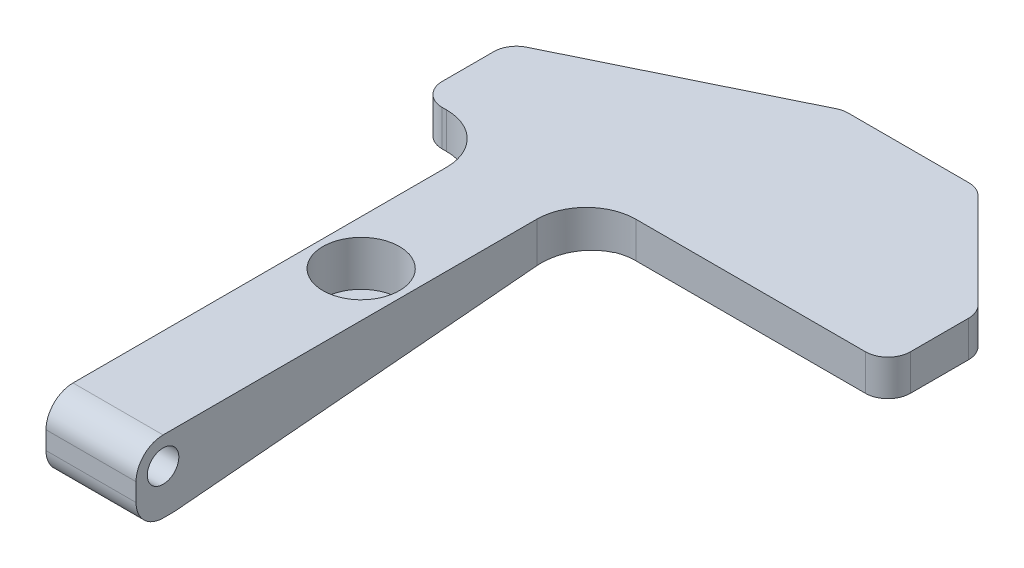
ISO-10303-21;
HEADER;
FILE_DESCRIPTION(('STEP AP214'),'2;1');
FILE_NAME('part.step','',(''),(''),'','','');
FILE_SCHEMA(('AUTOMOTIVE_DESIGN { 1 0 10303 214 1 1 1 1 }'));
ENDSEC;
DATA;
#1=APPLICATION_CONTEXT('core data for automotive mechanical design processes');
#2=APPLICATION_PROTOCOL_DEFINITION('international standard','automotive_design',2000,#1);
#3=PRODUCT_CONTEXT('',#1,'mechanical');
#4=PRODUCT('Part','Part','',(#3));
#5=PRODUCT_RELATED_PRODUCT_CATEGORY('part','',(#4));
#6=PRODUCT_DEFINITION_FORMATION('','',#4);
#7=PRODUCT_DEFINITION_CONTEXT('part definition',#1,'design');
#8=PRODUCT_DEFINITION('design','',#6,#7);
#9=PRODUCT_DEFINITION_SHAPE('','',#8);
#10=(LENGTH_UNIT() NAMED_UNIT(*) SI_UNIT(.MILLI.,.METRE.));
#11=(NAMED_UNIT(*) PLANE_ANGLE_UNIT() SI_UNIT($,.RADIAN.));
#12=(NAMED_UNIT(*) SI_UNIT($,.STERADIAN.) SOLID_ANGLE_UNIT());
#13=UNCERTAINTY_MEASURE_WITH_UNIT(LENGTH_MEASURE(1.E-05),#10,'distance_accuracy_value','');
#14=(GEOMETRIC_REPRESENTATION_CONTEXT(3) GLOBAL_UNCERTAINTY_ASSIGNED_CONTEXT((#13)) GLOBAL_UNIT_ASSIGNED_CONTEXT((#10,
#11,#12)) REPRESENTATION_CONTEXT('',''));
#15=CARTESIAN_POINT('',(0.,0.,0.));
#16=DIRECTION('',(0.,0.,1.));
#17=DIRECTION('',(1.,0.,0.));
#18=AXIS2_PLACEMENT_3D('',#15,#16,#17);
#19=CARTESIAN_POINT('',(8.5,0.,0.));
#20=DIRECTION('',(1.,0.,0.));
#21=DIRECTION('',(0.,0.,-1.));
#22=AXIS2_PLACEMENT_3D('',#19,#20,#21);
#23=PLANE('',#22);
#24=DIRECTION('',(0.,1.,0.));
#25=VECTOR('',#24,1.);
#26=CARTESIAN_POINT('',(8.5,-5.001,-46.6234753829799));
#27=LINE('',#26,#25);
#28=CARTESIAN_POINT('',(8.5,-1.,-46.6234753829799));
#29=VERTEX_POINT('',#28);
#30=CARTESIAN_POINT('',(8.5,-1.0329416355277,-46.6234753829799));
#31=VERTEX_POINT('',#30);
#32=EDGE_CURVE('E56',#29,#31,#27,.F.);
#33=ORIENTED_EDGE('',*,*,#32,.T.);
#34=DIRECTION('',(0.,0.0871557427476583,-0.996194698091746));
#35=VECTOR('',#34,1.);
#36=CARTESIAN_POINT('',(8.5,-5.07313605167897,-0.443841893046577));
#37=LINE('',#36,#35);
#38=CARTESIAN_POINT('',(8.5,-1.,-47.));
#39=VERTEX_POINT('',#38);
#40=EDGE_CURVE('E329',#31,#39,#37,.T.);
#41=ORIENTED_EDGE('',*,*,#40,.T.);
#42=DIRECTION('',(0.,0.,-1.));
#43=VECTOR('',#42,1.);
#44=CARTESIAN_POINT('',(8.5,-1.,0.));
#45=LINE('',#44,#43);
#46=EDGE_CURVE('E385',#29,#39,#45,.T.);
#47=ORIENTED_EDGE('',*,*,#46,.F.);
#48=EDGE_LOOP('',(#33,#41,#47));
#49=FACE_BOUND('',#48,.T.);
#50=ADVANCED_FACE('F41',(#49),#23,.T.);
#51=CARTESIAN_POINT('',(-8.5,0.,0.));
#52=DIRECTION('',(1.,0.,0.));
#53=DIRECTION('',(0.,0.,-1.));
#54=AXIS2_PLACEMENT_3D('',#51,#52,#53);
#55=PLANE('',#54);
#56=DIRECTION('',(0.,0.0871557427476583,-0.996194698091746));
#57=VECTOR('',#56,1.);
#58=CARTESIAN_POINT('',(-8.5,-5.07313605167897,-0.443841893046577));
#59=LINE('',#58,#57);
#60=CARTESIAN_POINT('',(-8.5,-1.03294163552769,-46.6234753829799));
#61=VERTEX_POINT('',#60);
#62=CARTESIAN_POINT('',(-8.5,-1.,-47.));
#63=VERTEX_POINT('',#62);
#64=EDGE_CURVE('E326',#61,#63,#59,.T.);
#65=ORIENTED_EDGE('',*,*,#64,.F.);
#66=DIRECTION('',(0.,1.,0.));
#67=VECTOR('',#66,1.);
#68=CARTESIAN_POINT('',(-8.5,-5.001,-46.6234753829799));
#69=LINE('',#68,#67);
#70=CARTESIAN_POINT('',(-8.5,-1.,-46.6234753829799));
#71=VERTEX_POINT('',#70);
#72=EDGE_CURVE('E369',#71,#61,#69,.F.);
#73=ORIENTED_EDGE('',*,*,#72,.F.);
#74=DIRECTION('',(0.,0.,1.));
#75=VECTOR('',#74,1.);
#76=CARTESIAN_POINT('',(-8.5,-1.,0.));
#77=LINE('',#76,#75);
#78=EDGE_CURVE('E381',#63,#71,#77,.T.);
#79=ORIENTED_EDGE('',*,*,#78,.F.);
#80=EDGE_LOOP('',(#65,#73,#79));
#81=FACE_BOUND('',#80,.T.);
#82=ADVANCED_FACE('F474',(#81),#55,.F.);
#83=CARTESIAN_POINT('',(8.5,3.,0.));
#84=DIRECTION('',(0.,1.,0.));
#85=DIRECTION('',(0.,0.,1.));
#86=AXIS2_PLACEMENT_3D('',#83,#84,#85);
#87=PLANE('',#86);
#88=DIRECTION('',(0.,0.,1.));
#89=VECTOR('',#88,1.);
#90=CARTESIAN_POINT('',(5.00000000000001,3.,3.));
#91=LINE('',#90,#89);
#92=CARTESIAN_POINT('',(4.99999999999999,3.,-41.5000000000004));
#93=VERTEX_POINT('',#92);
#94=CARTESIAN_POINT('',(5.,3.,0.));
#95=VERTEX_POINT('',#94);
#96=EDGE_CURVE('E221',#93,#95,#91,.T.);
#97=ORIENTED_EDGE('',*,*,#96,.F.);
#98=CARTESIAN_POINT('',(10.4999999999996,3.,-41.5000000000004));
#99=DIRECTION('',(0.,1.,0.));
#100=DIRECTION('',(0.,0.,1.));
#101=AXIS2_PLACEMENT_3D('',#98,#99,#100);
#102=CIRCLE('',#101,5.49999999999958);
#103=CARTESIAN_POINT('',(10.5,3.,-47.));
#104=VERTEX_POINT('',#103);
#105=EDGE_CURVE('E205',#104,#93,#102,.T.);
#106=ORIENTED_EDGE('',*,*,#105,.F.);
#107=DIRECTION('',(-1.,0.,0.));
#108=VECTOR('',#107,1.);
#109=CARTESIAN_POINT('',(0.,3.,-47.));
#110=LINE('',#109,#108);
#111=CARTESIAN_POINT('',(36.,3.,-47.));
#112=VERTEX_POINT('',#111);
#113=EDGE_CURVE('E219',#112,#104,#110,.T.);
#114=ORIENTED_EDGE('',*,*,#113,.F.);
#115=CARTESIAN_POINT('',(36.,3.,-49.5));
#116=DIRECTION('',(0.,1.,0.));
#117=DIRECTION('',(0.,0.,1.));
#118=AXIS2_PLACEMENT_3D('',#115,#116,#117);
#119=CIRCLE('',#118,2.5);
#120=CARTESIAN_POINT('',(38.5,3.,-49.5));
#121=VERTEX_POINT('',#120);
#122=EDGE_CURVE('E228',#121,#112,#119,.F.);
#123=ORIENTED_EDGE('',*,*,#122,.F.);
#124=DIRECTION('',(0.,0.,1.));
#125=VECTOR('',#124,1.);
#126=CARTESIAN_POINT('',(38.5000000000001,3.,0.));
#127=LINE('',#126,#125);
#128=CARTESIAN_POINT('',(38.5,3.,-55.9644660940673));
#129=VERTEX_POINT('',#128);
#130=EDGE_CURVE('E231',#129,#121,#127,.T.);
#131=ORIENTED_EDGE('',*,*,#130,.F.);
#132=CARTESIAN_POINT('',(36.,3.,-55.9644660940673));
#133=DIRECTION('',(0.,1.,0.));
#134=DIRECTION('',(0.,0.,1.));
#135=AXIS2_PLACEMENT_3D('',#132,#133,#134);
#136=CIRCLE('',#135,2.5);
#137=CARTESIAN_POINT('',(37.7677669529664,3.,-57.7322330470336));
#138=VERTEX_POINT('',#137);
#139=EDGE_CURVE('E238',#138,#129,#136,.F.);
#140=ORIENTED_EDGE('',*,*,#139,.F.);
#141=DIRECTION('',(0.707106781186549,0.,0.707106781186546));
#142=VECTOR('',#141,1.);
#143=CARTESIAN_POINT('',(47.7499999999999,3.,-47.7500000000001));
#144=LINE('',#143,#142);
#145=CARTESIAN_POINT('',(27.2322330470336,3.,-68.2677669529664));
#146=VERTEX_POINT('',#145);
#147=EDGE_CURVE('E240',#146,#138,#144,.T.);
#148=ORIENTED_EDGE('',*,*,#147,.F.);
#149=CARTESIAN_POINT('',(25.4644660940672,3.,-66.5));
#150=DIRECTION('',(0.,1.,0.));
#151=DIRECTION('',(0.,0.,1.));
#152=AXIS2_PLACEMENT_3D('',#149,#150,#151);
#153=CIRCLE('',#152,2.5);
#154=CARTESIAN_POINT('',(25.4644660940672,3.,-69.));
#155=VERTEX_POINT('',#154);
#156=EDGE_CURVE('E242',#155,#146,#153,.F.);
#157=ORIENTED_EDGE('',*,*,#156,.F.);
#158=DIRECTION('',(1.,0.,0.));
#159=VECTOR('',#158,1.);
#160=CARTESIAN_POINT('',(0.,3.,-69.));
#161=LINE('',#160,#159);
#162=CARTESIAN_POINT('',(12.0908773450815,3.,-69.));
#163=VERTEX_POINT('',#162);
#164=EDGE_CURVE('E244',#163,#155,#161,.T.);
#165=ORIENTED_EDGE('',*,*,#164,.F.);
#166=CARTESIAN_POINT('',(12.0908773450815,3.,-66.5));
#167=DIRECTION('',(0.,1.,0.));
#168=DIRECTION('',(0.,0.,1.));
#169=AXIS2_PLACEMENT_3D('',#166,#167,#168);
#170=CIRCLE('',#169,2.50000000000001);
#171=CARTESIAN_POINT('',(10.9949494781088,3.,-68.7469851157479));
#172=VERTEX_POINT('',#171);
#173=EDGE_CURVE('E246',#172,#163,#170,.F.);
#174=ORIENTED_EDGE('',*,*,#173,.F.);
#175=DIRECTION('',(0.898794046299168,0.,-0.438371146789076));
#176=VECTOR('',#175,1.);
#177=CARTESIAN_POINT('',(-24.9737904439826,3.,-51.2038584860941));
#178=LINE('',#177,#176);
#179=CARTESIAN_POINT('',(-12.0959278669727,3.,-57.4848117359746));
#180=VERTEX_POINT('',#179);
#181=EDGE_CURVE('E248',#180,#172,#178,.T.);
#182=ORIENTED_EDGE('',*,*,#181,.F.);
#183=CARTESIAN_POINT('',(-11.,3.,-55.2378266202267));
#184=DIRECTION('',(0.,1.,0.));
#185=DIRECTION('',(0.,0.,1.));
#186=AXIS2_PLACEMENT_3D('',#183,#184,#185);
#187=CIRCLE('',#186,2.5);
#188=CARTESIAN_POINT('',(-13.5,3.,-55.2378266202267));
#189=VERTEX_POINT('',#188);
#190=EDGE_CURVE('E250',#189,#180,#187,.F.);
#191=ORIENTED_EDGE('',*,*,#190,.F.);
#192=DIRECTION('',(0.,0.,-1.));
#193=VECTOR('',#192,1.);
#194=CARTESIAN_POINT('',(-13.5,3.,0.));
#195=LINE('',#194,#193);
#196=CARTESIAN_POINT('',(-13.5,3.,-49.5));
#197=VERTEX_POINT('',#196);
#198=EDGE_CURVE('E252',#197,#189,#195,.T.);
#199=ORIENTED_EDGE('',*,*,#198,.F.);
#200=CARTESIAN_POINT('',(-11.,3.,-49.5));
#201=DIRECTION('',(0.,1.,0.));
#202=DIRECTION('',(0.,0.,1.));
#203=AXIS2_PLACEMENT_3D('',#200,#201,#202);
#204=CIRCLE('',#203,2.5);
#205=CARTESIAN_POINT('',(-11.,3.,-47.));
#206=VERTEX_POINT('',#205);
#207=EDGE_CURVE('E233',#206,#197,#204,.F.);
#208=ORIENTED_EDGE('',*,*,#207,.F.);
#209=CARTESIAN_POINT('',(-10.5,3.,-47.));
#210=VERTEX_POINT('',#209);
#211=EDGE_CURVE('E229',#210,#206,#110,.T.);
#212=ORIENTED_EDGE('',*,*,#211,.F.);
#213=CARTESIAN_POINT('',(-10.4999999999996,3.,-41.5000000000004));
#214=DIRECTION('',(0.,1.,0.));
#215=DIRECTION('',(0.,0.,-1.));
#216=AXIS2_PLACEMENT_3D('',#213,#214,#215);
#217=CIRCLE('',#216,5.49999999999958);
#218=CARTESIAN_POINT('',(-5.,3.,-41.5000000000004));
#219=VERTEX_POINT('',#218);
#220=EDGE_CURVE('E366',#219,#210,#217,.T.);
#221=ORIENTED_EDGE('',*,*,#220,.F.);
#222=DIRECTION('',(0.,0.,-1.));
#223=VECTOR('',#222,1.);
#224=CARTESIAN_POINT('',(-5.,3.,3.));
#225=LINE('',#224,#223);
#226=CARTESIAN_POINT('',(-5.,3.,0.));
#227=VERTEX_POINT('',#226);
#228=EDGE_CURVE('E315',#227,#219,#225,.T.);
#229=ORIENTED_EDGE('',*,*,#228,.F.);
#230=DIRECTION('',(-1.,0.,0.));
#231=VECTOR('',#230,1.);
#232=CARTESIAN_POINT('',(8.5,3.,0.));
#233=LINE('',#232,#231);
#234=EDGE_CURVE('E341',#95,#227,#233,.T.);
#235=ORIENTED_EDGE('',*,*,#234,.F.);
#236=EDGE_LOOP('',(#97,#106,#114,#123,#131,#140,#148,#157,#165,#174,#182,#191,#199,#208,#212,
#221,#229,#235));
#237=FACE_BOUND('',#236,.T.);
#238=CARTESIAN_POINT('',(0.,3.,-27.));
#239=DIRECTION('',(0.,1.,0.));
#240=DIRECTION('',(0.,0.,1.));
#241=AXIS2_PLACEMENT_3D('',#238,#239,#240);
#242=CIRCLE('',#241,4.25);
#243=CARTESIAN_POINT('',(0.,3.,-22.75));
#244=VERTEX_POINT('',#243);
#245=EDGE_CURVE('E310',#244,#244,#242,.T.);
#246=ORIENTED_EDGE('',*,*,#245,.F.);
#247=EDGE_LOOP('',(#246));
#248=FACE_BOUND('',#247,.T.);
#249=ADVANCED_FACE('F216',(#237,#248),#87,.T.);
#250=CARTESIAN_POINT('',(8.5,0.,0.));
#251=DIRECTION('',(-1.,0.,0.));
#252=DIRECTION('',(0.,0.,1.));
#253=AXIS2_PLACEMENT_3D('',#250,#251,#252);
#254=CYLINDRICAL_SURFACE('',#253,3.);
#255=DIRECTION('',(-1.,0.,0.));
#256=VECTOR('',#255,1.);
#257=CARTESIAN_POINT('',(8.5,0.,3.));
#258=LINE('',#257,#256);
#259=CARTESIAN_POINT('',(5.00000000000001,0.,3.));
#260=VERTEX_POINT('',#259);
#261=CARTESIAN_POINT('',(-5.,0.,3.));
#262=VERTEX_POINT('',#261);
#263=EDGE_CURVE('E338',#260,#262,#258,.T.);
#264=ORIENTED_EDGE('',*,*,#263,.F.);
#265=CARTESIAN_POINT('',(5.00000000000001,0.,0.));
#266=DIRECTION('',(-1.,0.,0.));
#267=DIRECTION('',(0.,0.,1.));
#268=AXIS2_PLACEMENT_3D('',#265,#266,#267);
#269=CIRCLE('',#268,3.);
#270=EDGE_CURVE('E293',#95,#260,#269,.F.);
#271=ORIENTED_EDGE('',*,*,#270,.F.);
#272=ORIENTED_EDGE('',*,*,#234,.T.);
#273=CARTESIAN_POINT('',(-5.,0.,0.));
#274=DIRECTION('',(1.,0.,0.));
#275=DIRECTION('',(0.,0.,-1.));
#276=AXIS2_PLACEMENT_3D('',#273,#274,#275);
#277=CIRCLE('',#276,3.);
#278=EDGE_CURVE('E296',#262,#227,#277,.F.);
#279=ORIENTED_EDGE('',*,*,#278,.F.);
#280=EDGE_LOOP('',(#264,#271,#272,#279));
#281=FACE_BOUND('',#280,.T.);
#282=ADVANCED_FACE('F360',(#281),#254,.T.);
#283=CARTESIAN_POINT('',(8.5,0.,3.));
#284=DIRECTION('',(0.,0.,-1.));
#285=DIRECTION('',(0.,1.,0.));
#286=AXIS2_PLACEMENT_3D('',#283,#284,#285);
#287=PLANE('',#286);
#288=DIRECTION('',(-1.,0.,0.));
#289=VECTOR('',#288,1.);
#290=CARTESIAN_POINT('',(8.5,-2.,3.));
#291=LINE('',#290,#289);
#292=CARTESIAN_POINT('',(-5.,-2.,3.));
#293=VERTEX_POINT('',#292);
#294=CARTESIAN_POINT('',(5.00000000000001,-2.,3.));
#295=VERTEX_POINT('',#294);
#296=EDGE_CURVE('E11',#293,#295,#291,.F.);
#297=ORIENTED_EDGE('',*,*,#296,.T.);
#298=DIRECTION('',(0.,1.,0.));
#299=VECTOR('',#298,1.);
#300=CARTESIAN_POINT('',(5.00000000000001,-5.001,3.));
#301=LINE('',#300,#299);
#302=EDGE_CURVE('E307',#295,#260,#301,.T.);
#303=ORIENTED_EDGE('',*,*,#302,.T.);
#304=ORIENTED_EDGE('',*,*,#263,.T.);
#305=DIRECTION('',(0.,1.,0.));
#306=VECTOR('',#305,1.);
#307=CARTESIAN_POINT('',(-5.,-5.001,3.));
#308=LINE('',#307,#306);
#309=EDGE_CURVE('E318',#293,#262,#308,.T.);
#310=ORIENTED_EDGE('',*,*,#309,.F.);
#311=EDGE_LOOP('',(#297,#303,#304,#310));
#312=FACE_BOUND('',#311,.T.);
#313=ADVANCED_FACE('F356',(#312),#287,.F.);
#314=CARTESIAN_POINT('',(8.5,-5.,0.));
#315=DIRECTION('',(0.,1.,0.));
#316=DIRECTION('',(0.,0.,1.));
#317=AXIS2_PLACEMENT_3D('',#314,#315,#316);
#318=PLANE('',#317);
#319=DIRECTION('',(-1.,0.,0.));
#320=VECTOR('',#319,1.);
#321=CARTESIAN_POINT('',(8.5,-5.,-1.2797907889547));
#322=LINE('',#321,#320);
#323=CARTESIAN_POINT('',(5.,-5.,-1.2797907889547));
#324=VERTEX_POINT('',#323);
#325=CARTESIAN_POINT('',(-5.,-5.,-1.2797907889547));
#326=VERTEX_POINT('',#325);
#327=EDGE_CURVE('E335',#324,#326,#322,.T.);
#328=ORIENTED_EDGE('',*,*,#327,.F.);
#329=DIRECTION('',(0.,0.,-1.));
#330=VECTOR('',#329,1.);
#331=CARTESIAN_POINT('',(5.00000000000001,-5.,3.));
#332=LINE('',#331,#330);
#333=CARTESIAN_POINT('',(5.00000000000001,-5.,0.));
#334=VERTEX_POINT('',#333);
#335=EDGE_CURVE('E304',#334,#324,#332,.T.);
#336=ORIENTED_EDGE('',*,*,#335,.F.);
#337=DIRECTION('',(-1.,0.,0.));
#338=VECTOR('',#337,1.);
#339=CARTESIAN_POINT('',(8.5,-5.,0.));
#340=LINE('',#339,#338);
#341=CARTESIAN_POINT('',(-5.,-5.,0.));
#342=VERTEX_POINT('',#341);
#343=EDGE_CURVE('E49',#334,#342,#340,.T.);
#344=ORIENTED_EDGE('',*,*,#343,.T.);
#345=DIRECTION('',(0.,0.,1.));
#346=VECTOR('',#345,1.);
#347=CARTESIAN_POINT('',(-5.,-5.,3.));
#348=LINE('',#347,#346);
#349=EDGE_CURVE('E64',#326,#342,#348,.T.);
#350=ORIENTED_EDGE('',*,*,#349,.F.);
#351=EDGE_LOOP('',(#328,#336,#344,#350));
#352=FACE_BOUND('',#351,.T.);
#353=ADVANCED_FACE('F348',(#352),#318,.F.);
#354=CARTESIAN_POINT('',(8.5,-5.07313605167897,-0.443841893046577));
#355=DIRECTION('',(0.,0.996194698091746,0.0871557427476583));
#356=DIRECTION('',(0.,-0.0871557427476583,0.996194698091746));
#357=AXIS2_PLACEMENT_3D('',#354,#355,#356);
#358=PLANE('',#357);
#359=CARTESIAN_POINT('',(10.4999999999996,-1.48118764939255,-41.5000000000004));
#360=DIRECTION('',(0.,0.996194698091746,0.0871557427476583));
#361=DIRECTION('',(0.,0.0871557427476583,-0.996194698091746));
#362=AXIS2_PLACEMENT_3D('',#359,#360,#361);
#363=ELLIPSE('',#362,5.52100910648799,5.49999999999958);
#364=CARTESIAN_POINT('',(4.99999999999999,-1.48118764939255,-41.5000000000004));
#365=VERTEX_POINT('',#364);
#366=EDGE_CURVE('E459',#365,#31,#363,.F.);
#367=ORIENTED_EDGE('',*,*,#366,.F.);
#368=DIRECTION('',(0.,0.0871557427476583,-0.996194698091746));
#369=VECTOR('',#368,1.);
#370=CARTESIAN_POINT('',(5.00000000000001,-5.37159653177234,2.96757700472789));
#371=LINE('',#370,#369);
#372=EDGE_CURVE('E302',#324,#365,#371,.T.);
#373=ORIENTED_EDGE('',*,*,#372,.F.);
#374=ORIENTED_EDGE('',*,*,#327,.T.);
#375=DIRECTION('',(0.,-0.0871557427476583,0.996194698091746));
#376=VECTOR('',#375,1.);
#377=CARTESIAN_POINT('',(-5.,-5.37159653177234,2.96757700472789));
#378=LINE('',#377,#376);
#379=CARTESIAN_POINT('',(-5.,-1.48118764939255,-41.5000000000004));
#380=VERTEX_POINT('',#379);
#381=EDGE_CURVE('E258',#380,#326,#378,.T.);
#382=ORIENTED_EDGE('',*,*,#381,.F.);
#383=CARTESIAN_POINT('',(-10.4999999999996,-1.48118764939255,-41.5000000000004));
#384=DIRECTION('',(0.,0.996194698091746,0.0871557427476583));
#385=DIRECTION('',(0.,0.0871557427476583,-0.996194698091746));
#386=AXIS2_PLACEMENT_3D('',#383,#384,#385);
#387=ELLIPSE('',#386,5.52100910648799,5.49999999999958);
#388=EDGE_CURVE('E464',#61,#380,#387,.F.);
#389=ORIENTED_EDGE('',*,*,#388,.F.);
#390=ORIENTED_EDGE('',*,*,#64,.T.);
#391=DIRECTION('',(-1.,0.,0.));
#392=VECTOR('',#391,1.);
#393=CARTESIAN_POINT('',(8.5,-1.,-47.));
#394=LINE('',#393,#392);
#395=EDGE_CURVE('E331',#39,#63,#394,.T.);
#396=ORIENTED_EDGE('',*,*,#395,.F.);
#397=ORIENTED_EDGE('',*,*,#40,.F.);
#398=EDGE_LOOP('',(#367,#373,#374,#382,#389,#390,#396,#397));
#399=FACE_BOUND('',#398,.T.);
#400=ADVANCED_FACE('F479',(#399),#358,.F.);
#401=CARTESIAN_POINT('',(8.5,-2.,0.));
#402=DIRECTION('',(-1.,0.,0.));
#403=DIRECTION('',(0.,0.,1.));
#404=AXIS2_PLACEMENT_3D('',#401,#402,#403);
#405=CYLINDRICAL_SURFACE('',#404,3.);
#406=CARTESIAN_POINT('',(5.00000000000001,-2.,0.));
#407=DIRECTION('',(-1.,0.,0.));
#408=DIRECTION('',(0.,0.,1.));
#409=AXIS2_PLACEMENT_3D('',#406,#407,#408);
#410=CIRCLE('',#409,3.);
#411=EDGE_CURVE('E295',#334,#295,#410,.T.);
#412=ORIENTED_EDGE('',*,*,#411,.T.);
#413=ORIENTED_EDGE('',*,*,#296,.F.);
#414=CARTESIAN_POINT('',(-5.,-2.,0.));
#415=DIRECTION('',(1.,0.,0.));
#416=DIRECTION('',(0.,0.,-1.));
#417=AXIS2_PLACEMENT_3D('',#414,#415,#416);
#418=CIRCLE('',#417,3.);
#419=EDGE_CURVE('E314',#293,#342,#418,.T.);
#420=ORIENTED_EDGE('',*,*,#419,.T.);
#421=ORIENTED_EDGE('',*,*,#343,.F.);
#422=EDGE_LOOP('',(#412,#413,#420,#421));
#423=FACE_BOUND('',#422,.T.);
#424=ADVANCED_FACE('F43',(#423),#405,.T.);
#425=CARTESIAN_POINT('',(0.,-2.,-27.));
#426=DIRECTION('',(0.,1.,0.));
#427=DIRECTION('',(0.,0.,1.));
#428=AXIS2_PLACEMENT_3D('',#425,#426,#427);
#429=CYLINDRICAL_SURFACE('',#428,4.25);
#430=CARTESIAN_POINT('',(0.,-2.,-27.));
#431=DIRECTION('',(0.,1.,0.));
#432=DIRECTION('',(0.,0.,1.));
#433=AXIS2_PLACEMENT_3D('',#430,#431,#432);
#434=CIRCLE('',#433,4.25);
#435=CARTESIAN_POINT('',(0.,-2.,-22.75));
#436=VERTEX_POINT('',#435);
#437=EDGE_CURVE('E323',#436,#436,#434,.T.);
#438=ORIENTED_EDGE('',*,*,#437,.F.);
#439=EDGE_LOOP('',(#438));
#440=FACE_BOUND('',#439,.T.);
#441=ORIENTED_EDGE('',*,*,#245,.T.);
#442=EDGE_LOOP('',(#441));
#443=FACE_BOUND('',#442,.T.);
#444=ADVANCED_FACE('F499',(#440,#443),#429,.F.);
#445=CARTESIAN_POINT('',(0.,-2.,-27.));
#446=DIRECTION('',(0.,1.,0.));
#447=DIRECTION('',(0.,0.,1.));
#448=AXIS2_PLACEMENT_3D('',#445,#446,#447);
#449=PLANE('',#448);
#450=ORIENTED_EDGE('',*,*,#437,.T.);
#451=EDGE_LOOP('',(#450));
#452=FACE_BOUND('',#451,.T.);
#453=ADVANCED_FACE('F493',(#452),#449,.T.);
#454=CARTESIAN_POINT('',(-5.,-5.001,3.));
#455=DIRECTION('',(1.,0.,0.));
#456=DIRECTION('',(0.,0.,-1.));
#457=AXIS2_PLACEMENT_3D('',#454,#455,#456);
#458=PLANE('',#457);
#459=ORIENTED_EDGE('',*,*,#278,.T.);
#460=ORIENTED_EDGE('',*,*,#228,.T.);
#461=DIRECTION('',(0.,1.,0.));
#462=VECTOR('',#461,1.);
#463=CARTESIAN_POINT('',(-5.,-5.001,-41.5000000000004));
#464=LINE('',#463,#462);
#465=EDGE_CURVE('E370',#380,#219,#464,.T.);
#466=ORIENTED_EDGE('',*,*,#465,.F.);
#467=ORIENTED_EDGE('',*,*,#381,.T.);
#468=ORIENTED_EDGE('',*,*,#349,.T.);
#469=ORIENTED_EDGE('',*,*,#419,.F.);
#470=ORIENTED_EDGE('',*,*,#309,.T.);
#471=EDGE_LOOP('',(#459,#460,#466,#467,#468,#469,#470));
#472=FACE_BOUND('',#471,.T.);
#473=CARTESIAN_POINT('',(-5.,0.,0.));
#474=DIRECTION('',(1.,0.,0.));
#475=DIRECTION('',(0.,0.,-1.));
#476=AXIS2_PLACEMENT_3D('',#473,#474,#475);
#477=CIRCLE('',#476,1.75);
#478=CARTESIAN_POINT('',(-5.,0.,-1.75));
#479=VERTEX_POINT('',#478);
#480=EDGE_CURVE('E311',#479,#479,#477,.F.);
#481=ORIENTED_EDGE('',*,*,#480,.F.);
#482=EDGE_LOOP('',(#481));
#483=FACE_BOUND('',#482,.T.);
#484=ADVANCED_FACE('F352',(#472,#483),#458,.F.);
#485=CARTESIAN_POINT('',(5.00000000000001,-5.001,3.));
#486=DIRECTION('',(-1.,0.,0.));
#487=DIRECTION('',(0.,0.,1.));
#488=AXIS2_PLACEMENT_3D('',#485,#486,#487);
#489=PLANE('',#488);
#490=ORIENTED_EDGE('',*,*,#270,.T.);
#491=ORIENTED_EDGE('',*,*,#302,.F.);
#492=ORIENTED_EDGE('',*,*,#411,.F.);
#493=ORIENTED_EDGE('',*,*,#335,.T.);
#494=ORIENTED_EDGE('',*,*,#372,.T.);
#495=DIRECTION('',(0.,1.,0.));
#496=VECTOR('',#495,1.);
#497=CARTESIAN_POINT('',(4.99999999999999,-5.001,-41.5000000000004));
#498=LINE('',#497,#496);
#499=EDGE_CURVE('E223',#365,#93,#498,.T.);
#500=ORIENTED_EDGE('',*,*,#499,.T.);
#501=ORIENTED_EDGE('',*,*,#96,.T.);
#502=EDGE_LOOP('',(#490,#491,#492,#493,#494,#500,#501));
#503=FACE_BOUND('',#502,.T.);
#504=CARTESIAN_POINT('',(5.00000000000001,0.,0.));
#505=DIRECTION('',(-1.,0.,0.));
#506=DIRECTION('',(0.,0.,1.));
#507=AXIS2_PLACEMENT_3D('',#504,#505,#506);
#508=CIRCLE('',#507,1.75);
#509=CARTESIAN_POINT('',(5.00000000000001,0.,1.75));
#510=VERTEX_POINT('',#509);
#511=EDGE_CURVE('E299',#510,#510,#508,.F.);
#512=ORIENTED_EDGE('',*,*,#511,.F.);
#513=EDGE_LOOP('',(#512));
#514=FACE_BOUND('',#513,.T.);
#515=ADVANCED_FACE('F482',(#503,#514),#489,.F.);
#516=CARTESIAN_POINT('',(8.5,0.,0.));
#517=DIRECTION('',(-1.,0.,0.));
#518=DIRECTION('',(0.,0.,1.));
#519=AXIS2_PLACEMENT_3D('',#516,#517,#518);
#520=CYLINDRICAL_SURFACE('',#519,1.75);
#521=ORIENTED_EDGE('',*,*,#511,.T.);
#522=EDGE_LOOP('',(#521));
#523=FACE_BOUND('',#522,.T.);
#524=ORIENTED_EDGE('',*,*,#480,.T.);
#525=EDGE_LOOP('',(#524));
#526=FACE_BOUND('',#525,.T.);
#527=ADVANCED_FACE('F485',(#523,#526),#520,.F.);
#528=CARTESIAN_POINT('',(-11.,-1.,-49.5));
#529=DIRECTION('',(0.,1.,0.));
#530=DIRECTION('',(0.,0.,1.));
#531=AXIS2_PLACEMENT_3D('',#528,#529,#530);
#532=CYLINDRICAL_SURFACE('',#531,2.5);
#533=ORIENTED_EDGE('',*,*,#207,.T.);
#534=DIRECTION('',(0.,1.,0.));
#535=VECTOR('',#534,1.);
#536=CARTESIAN_POINT('',(-13.5,-1.,-49.5));
#537=LINE('',#536,#535);
#538=CARTESIAN_POINT('',(-13.5,-1.,-49.5));
#539=VERTEX_POINT('',#538);
#540=EDGE_CURVE('E255',#539,#197,#537,.T.);
#541=ORIENTED_EDGE('',*,*,#540,.F.);
#542=CARTESIAN_POINT('',(-11.,-1.,-49.5));
#543=DIRECTION('',(0.,1.,0.));
#544=DIRECTION('',(0.,0.,1.));
#545=AXIS2_PLACEMENT_3D('',#542,#543,#544);
#546=CIRCLE('',#545,2.5);
#547=CARTESIAN_POINT('',(-11.,-1.,-47.));
#548=VERTEX_POINT('',#547);
#549=EDGE_CURVE('E254',#548,#539,#546,.F.);
#550=ORIENTED_EDGE('',*,*,#549,.F.);
#551=DIRECTION('',(0.,1.,0.));
#552=VECTOR('',#551,1.);
#553=CARTESIAN_POINT('',(-11.,-1.,-47.));
#554=LINE('',#553,#552);
#555=EDGE_CURVE('E289',#548,#206,#554,.T.);
#556=ORIENTED_EDGE('',*,*,#555,.T.);
#557=EDGE_LOOP('',(#533,#541,#550,#556));
#558=FACE_BOUND('',#557,.T.);
#559=ADVANCED_FACE('F457',(#558),#532,.T.);
#560=CARTESIAN_POINT('',(-13.5,-1.,0.));
#561=DIRECTION('',(1.,0.,0.));
#562=DIRECTION('',(0.,0.,-1.));
#563=AXIS2_PLACEMENT_3D('',#560,#561,#562);
#564=PLANE('',#563);
#565=ORIENTED_EDGE('',*,*,#198,.T.);
#566=DIRECTION('',(0.,1.,0.));
#567=VECTOR('',#566,1.);
#568=CARTESIAN_POINT('',(-13.5,-1.,-55.2378266202267));
#569=LINE('',#568,#567);
#570=CARTESIAN_POINT('',(-13.5,-1.,-55.2378266202267));
#571=VERTEX_POINT('',#570);
#572=EDGE_CURVE('E259',#571,#189,#569,.T.);
#573=ORIENTED_EDGE('',*,*,#572,.F.);
#574=DIRECTION('',(0.,0.,-1.));
#575=VECTOR('',#574,1.);
#576=CARTESIAN_POINT('',(-13.5,-1.,0.));
#577=LINE('',#576,#575);
#578=EDGE_CURVE('E292',#539,#571,#577,.T.);
#579=ORIENTED_EDGE('',*,*,#578,.F.);
#580=ORIENTED_EDGE('',*,*,#540,.T.);
#581=EDGE_LOOP('',(#565,#573,#579,#580));
#582=FACE_BOUND('',#581,.T.);
#583=ADVANCED_FACE('F413',(#582),#564,.F.);
#584=CARTESIAN_POINT('',(-11.,-1.,-55.2378266202267));
#585=DIRECTION('',(0.,1.,0.));
#586=DIRECTION('',(0.,0.,1.));
#587=AXIS2_PLACEMENT_3D('',#584,#585,#586);
#588=CYLINDRICAL_SURFACE('',#587,2.5);
#589=ORIENTED_EDGE('',*,*,#190,.T.);
#590=DIRECTION('',(0.,1.,0.));
#591=VECTOR('',#590,1.);
#592=CARTESIAN_POINT('',(-12.0959278669727,-1.,-57.4848117359746));
#593=LINE('',#592,#591);
#594=CARTESIAN_POINT('',(-12.0959278669727,-1.,-57.4848117359746));
#595=VERTEX_POINT('',#594);
#596=EDGE_CURVE('E262',#595,#180,#593,.T.);
#597=ORIENTED_EDGE('',*,*,#596,.F.);
#598=CARTESIAN_POINT('',(-11.,-1.,-55.2378266202267));
#599=DIRECTION('',(0.,1.,0.));
#600=DIRECTION('',(0.,0.,1.));
#601=AXIS2_PLACEMENT_3D('',#598,#599,#600);
#602=CIRCLE('',#601,2.5);
#603=EDGE_CURVE('E404',#571,#595,#602,.F.);
#604=ORIENTED_EDGE('',*,*,#603,.F.);
#605=ORIENTED_EDGE('',*,*,#572,.T.);
#606=EDGE_LOOP('',(#589,#597,#604,#605));
#607=FACE_BOUND('',#606,.T.);
#608=ADVANCED_FACE('F416',(#607),#588,.T.);
#609=CARTESIAN_POINT('',(-24.9737904439826,-1.,-51.2038584860941));
#610=DIRECTION('',(0.438371146789076,0.,0.898794046299168));
#611=DIRECTION('',(0.898794046299168,0.,-0.438371146789076));
#612=AXIS2_PLACEMENT_3D('',#609,#610,#611);
#613=PLANE('',#612);
#614=ORIENTED_EDGE('',*,*,#181,.T.);
#615=DIRECTION('',(0.,1.,0.));
#616=VECTOR('',#615,1.);
#617=CARTESIAN_POINT('',(10.9949494781088,-1.,-68.7469851157479));
#618=LINE('',#617,#616);
#619=CARTESIAN_POINT('',(10.9949494781088,-1.,-68.7469851157479));
#620=VERTEX_POINT('',#619);
#621=EDGE_CURVE('E265',#620,#172,#618,.T.);
#622=ORIENTED_EDGE('',*,*,#621,.F.);
#623=DIRECTION('',(0.898794046299168,0.,-0.438371146789076));
#624=VECTOR('',#623,1.);
#625=CARTESIAN_POINT('',(-24.9737904439826,-1.,-51.2038584860941));
#626=LINE('',#625,#624);
#627=EDGE_CURVE('E402',#595,#620,#626,.T.);
#628=ORIENTED_EDGE('',*,*,#627,.F.);
#629=ORIENTED_EDGE('',*,*,#596,.T.);
#630=EDGE_LOOP('',(#614,#622,#628,#629));
#631=FACE_BOUND('',#630,.T.);
#632=ADVANCED_FACE('F421',(#631),#613,.F.);
#633=CARTESIAN_POINT('',(12.0908773450815,-1.,-66.5));
#634=DIRECTION('',(0.,1.,0.));
#635=DIRECTION('',(0.,0.,1.));
#636=AXIS2_PLACEMENT_3D('',#633,#634,#635);
#637=CYLINDRICAL_SURFACE('',#636,2.50000000000001);
#638=ORIENTED_EDGE('',*,*,#173,.T.);
#639=DIRECTION('',(0.,1.,0.));
#640=VECTOR('',#639,1.);
#641=CARTESIAN_POINT('',(12.0908773450815,-1.,-69.));
#642=LINE('',#641,#640);
#643=CARTESIAN_POINT('',(12.0908773450815,-1.,-69.));
#644=VERTEX_POINT('',#643);
#645=EDGE_CURVE('E268',#644,#163,#642,.T.);
#646=ORIENTED_EDGE('',*,*,#645,.F.);
#647=CARTESIAN_POINT('',(12.0908773450815,-1.,-66.5));
#648=DIRECTION('',(0.,1.,0.));
#649=DIRECTION('',(0.,0.,1.));
#650=AXIS2_PLACEMENT_3D('',#647,#648,#649);
#651=CIRCLE('',#650,2.50000000000001);
#652=EDGE_CURVE('E400',#620,#644,#651,.F.);
#653=ORIENTED_EDGE('',*,*,#652,.F.);
#654=ORIENTED_EDGE('',*,*,#621,.T.);
#655=EDGE_LOOP('',(#638,#646,#653,#654));
#656=FACE_BOUND('',#655,.T.);
#657=ADVANCED_FACE('F427',(#656),#637,.T.);
#658=CARTESIAN_POINT('',(0.,-1.,-69.));
#659=DIRECTION('',(0.,0.,1.));
#660=DIRECTION('',(1.,0.,0.));
#661=AXIS2_PLACEMENT_3D('',#658,#659,#660);
#662=PLANE('',#661);
#663=ORIENTED_EDGE('',*,*,#164,.T.);
#664=DIRECTION('',(0.,1.,0.));
#665=VECTOR('',#664,1.);
#666=CARTESIAN_POINT('',(25.4644660940672,-1.,-69.));
#667=LINE('',#666,#665);
#668=CARTESIAN_POINT('',(25.4644660940672,-1.,-69.));
#669=VERTEX_POINT('',#668);
#670=EDGE_CURVE('E271',#669,#155,#667,.T.);
#671=ORIENTED_EDGE('',*,*,#670,.F.);
#672=DIRECTION('',(1.,0.,0.));
#673=VECTOR('',#672,1.);
#674=CARTESIAN_POINT('',(0.,-1.,-69.));
#675=LINE('',#674,#673);
#676=EDGE_CURVE('E398',#644,#669,#675,.T.);
#677=ORIENTED_EDGE('',*,*,#676,.F.);
#678=ORIENTED_EDGE('',*,*,#645,.T.);
#679=EDGE_LOOP('',(#663,#671,#677,#678));
#680=FACE_BOUND('',#679,.T.);
#681=ADVANCED_FACE('F431',(#680),#662,.F.);
#682=CARTESIAN_POINT('',(25.4644660940672,-1.,-66.5));
#683=DIRECTION('',(0.,1.,0.));
#684=DIRECTION('',(0.,0.,1.));
#685=AXIS2_PLACEMENT_3D('',#682,#683,#684);
#686=CYLINDRICAL_SURFACE('',#685,2.5);
#687=ORIENTED_EDGE('',*,*,#156,.T.);
#688=DIRECTION('',(0.,1.,0.));
#689=VECTOR('',#688,1.);
#690=CARTESIAN_POINT('',(27.2322330470336,-1.,-68.2677669529664));
#691=LINE('',#690,#689);
#692=CARTESIAN_POINT('',(27.2322330470336,-1.,-68.2677669529664));
#693=VERTEX_POINT('',#692);
#694=EDGE_CURVE('E274',#693,#146,#691,.T.);
#695=ORIENTED_EDGE('',*,*,#694,.F.);
#696=CARTESIAN_POINT('',(25.4644660940672,-1.,-66.5));
#697=DIRECTION('',(0.,1.,0.));
#698=DIRECTION('',(0.,0.,1.));
#699=AXIS2_PLACEMENT_3D('',#696,#697,#698);
#700=CIRCLE('',#699,2.5);
#701=EDGE_CURVE('E396',#669,#693,#700,.F.);
#702=ORIENTED_EDGE('',*,*,#701,.F.);
#703=ORIENTED_EDGE('',*,*,#670,.T.);
#704=EDGE_LOOP('',(#687,#695,#702,#703));
#705=FACE_BOUND('',#704,.T.);
#706=ADVANCED_FACE('F436',(#705),#686,.T.);
#707=CARTESIAN_POINT('',(47.7499999999999,-1.,-47.7500000000001));
#708=DIRECTION('',(-0.707106781186546,0.,0.707106781186549));
#709=DIRECTION('',(0.707106781186549,0.,0.707106781186546));
#710=AXIS2_PLACEMENT_3D('',#707,#708,#709);
#711=PLANE('',#710);
#712=ORIENTED_EDGE('',*,*,#147,.T.);
#713=DIRECTION('',(0.,1.,0.));
#714=VECTOR('',#713,1.);
#715=CARTESIAN_POINT('',(37.7677669529664,-1.,-57.7322330470336));
#716=LINE('',#715,#714);
#717=CARTESIAN_POINT('',(37.7677669529664,-1.,-57.7322330470336));
#718=VERTEX_POINT('',#717);
#719=EDGE_CURVE('E277',#718,#138,#716,.T.);
#720=ORIENTED_EDGE('',*,*,#719,.F.);
#721=DIRECTION('',(0.707106781186549,0.,0.707106781186546));
#722=VECTOR('',#721,1.);
#723=CARTESIAN_POINT('',(47.7499999999999,-1.,-47.7500000000001));
#724=LINE('',#723,#722);
#725=EDGE_CURVE('E394',#693,#718,#724,.T.);
#726=ORIENTED_EDGE('',*,*,#725,.F.);
#727=ORIENTED_EDGE('',*,*,#694,.T.);
#728=EDGE_LOOP('',(#712,#720,#726,#727));
#729=FACE_BOUND('',#728,.T.);
#730=ADVANCED_FACE('F442',(#729),#711,.F.);
#731=CARTESIAN_POINT('',(36.,-1.,-55.9644660940673));
#732=DIRECTION('',(0.,1.,0.));
#733=DIRECTION('',(0.,0.,1.));
#734=AXIS2_PLACEMENT_3D('',#731,#732,#733);
#735=CYLINDRICAL_SURFACE('',#734,2.5);
#736=ORIENTED_EDGE('',*,*,#139,.T.);
#737=DIRECTION('',(0.,1.,0.));
#738=VECTOR('',#737,1.);
#739=CARTESIAN_POINT('',(38.5,-1.,-55.9644660940673));
#740=LINE('',#739,#738);
#741=CARTESIAN_POINT('',(38.5,-1.,-55.9644660940673));
#742=VERTEX_POINT('',#741);
#743=EDGE_CURVE('E280',#742,#129,#740,.T.);
#744=ORIENTED_EDGE('',*,*,#743,.F.);
#745=CARTESIAN_POINT('',(36.,-1.,-55.9644660940673));
#746=DIRECTION('',(0.,1.,0.));
#747=DIRECTION('',(0.,0.,1.));
#748=AXIS2_PLACEMENT_3D('',#745,#746,#747);
#749=CIRCLE('',#748,2.5);
#750=EDGE_CURVE('E392',#718,#742,#749,.F.);
#751=ORIENTED_EDGE('',*,*,#750,.F.);
#752=ORIENTED_EDGE('',*,*,#719,.T.);
#753=EDGE_LOOP('',(#736,#744,#751,#752));
#754=FACE_BOUND('',#753,.T.);
#755=ADVANCED_FACE('F446',(#754),#735,.T.);
#756=CARTESIAN_POINT('',(38.5000000000001,-1.,0.));
#757=DIRECTION('',(-1.,0.,0.));
#758=DIRECTION('',(0.,0.,1.));
#759=AXIS2_PLACEMENT_3D('',#756,#757,#758);
#760=PLANE('',#759);
#761=ORIENTED_EDGE('',*,*,#130,.T.);
#762=DIRECTION('',(0.,1.,0.));
#763=VECTOR('',#762,1.);
#764=CARTESIAN_POINT('',(38.5,-1.,-49.5));
#765=LINE('',#764,#763);
#766=CARTESIAN_POINT('',(38.5,-1.,-49.5));
#767=VERTEX_POINT('',#766);
#768=EDGE_CURVE('E283',#767,#121,#765,.T.);
#769=ORIENTED_EDGE('',*,*,#768,.F.);
#770=DIRECTION('',(0.,0.,1.));
#771=VECTOR('',#770,1.);
#772=CARTESIAN_POINT('',(38.5000000000001,-1.,0.));
#773=LINE('',#772,#771);
#774=EDGE_CURVE('E390',#742,#767,#773,.T.);
#775=ORIENTED_EDGE('',*,*,#774,.F.);
#776=ORIENTED_EDGE('',*,*,#743,.T.);
#777=EDGE_LOOP('',(#761,#769,#775,#776));
#778=FACE_BOUND('',#777,.T.);
#779=ADVANCED_FACE('F451',(#778),#760,.F.);
#780=CARTESIAN_POINT('',(36.,-1.,-49.5));
#781=DIRECTION('',(0.,1.,0.));
#782=DIRECTION('',(0.,0.,1.));
#783=AXIS2_PLACEMENT_3D('',#780,#781,#782);
#784=CYLINDRICAL_SURFACE('',#783,2.5);
#785=ORIENTED_EDGE('',*,*,#122,.T.);
#786=DIRECTION('',(0.,1.,0.));
#787=VECTOR('',#786,1.);
#788=CARTESIAN_POINT('',(36.,-1.,-47.));
#789=LINE('',#788,#787);
#790=CARTESIAN_POINT('',(36.,-1.,-47.));
#791=VERTEX_POINT('',#790);
#792=EDGE_CURVE('E211',#791,#112,#789,.T.);
#793=ORIENTED_EDGE('',*,*,#792,.F.);
#794=CARTESIAN_POINT('',(36.,-1.,-49.5));
#795=DIRECTION('',(0.,1.,0.));
#796=DIRECTION('',(0.,0.,1.));
#797=AXIS2_PLACEMENT_3D('',#794,#795,#796);
#798=CIRCLE('',#797,2.5);
#799=EDGE_CURVE('E388',#767,#791,#798,.F.);
#800=ORIENTED_EDGE('',*,*,#799,.F.);
#801=ORIENTED_EDGE('',*,*,#768,.T.);
#802=EDGE_LOOP('',(#785,#793,#800,#801));
#803=FACE_BOUND('',#802,.T.);
#804=ADVANCED_FACE('F454',(#803),#784,.T.);
#805=CARTESIAN_POINT('',(0.,-1.,-47.));
#806=DIRECTION('',(0.,0.,-1.));
#807=DIRECTION('',(-1.,0.,0.));
#808=AXIS2_PLACEMENT_3D('',#805,#806,#807);
#809=PLANE('',#808);
#810=ORIENTED_EDGE('',*,*,#113,.T.);
#811=DIRECTION('',(0.,1.,0.));
#812=VECTOR('',#811,1.);
#813=CARTESIAN_POINT('',(10.5,-1.,-47.));
#814=LINE('',#813,#812);
#815=CARTESIAN_POINT('',(10.5,-1.,-47.));
#816=VERTEX_POINT('',#815);
#817=EDGE_CURVE('E201',#816,#104,#814,.T.);
#818=ORIENTED_EDGE('',*,*,#817,.F.);
#819=DIRECTION('',(-1.,0.,0.));
#820=VECTOR('',#819,1.);
#821=CARTESIAN_POINT('',(0.,-1.,-47.));
#822=LINE('',#821,#820);
#823=EDGE_CURVE('E382',#791,#816,#822,.T.);
#824=ORIENTED_EDGE('',*,*,#823,.F.);
#825=ORIENTED_EDGE('',*,*,#792,.T.);
#826=EDGE_LOOP('',(#810,#818,#824,#825));
#827=FACE_BOUND('',#826,.T.);
#828=ADVANCED_FACE('F226',(#827),#809,.F.);
#829=ORIENTED_EDGE('',*,*,#211,.T.);
#830=ORIENTED_EDGE('',*,*,#555,.F.);
#831=CARTESIAN_POINT('',(-10.5,-1.,-47.));
#832=VERTEX_POINT('',#831);
#833=EDGE_CURVE('E379',#832,#548,#822,.T.);
#834=ORIENTED_EDGE('',*,*,#833,.F.);
#835=DIRECTION('',(0.,1.,0.));
#836=VECTOR('',#835,1.);
#837=CARTESIAN_POINT('',(-10.5,-1.,-47.));
#838=LINE('',#837,#836);
#839=EDGE_CURVE('E212',#832,#210,#838,.T.);
#840=ORIENTED_EDGE('',*,*,#839,.T.);
#841=EDGE_LOOP('',(#829,#830,#834,#840));
#842=FACE_BOUND('',#841,.T.);
#843=ADVANCED_FACE('F694',(#842),#809,.F.);
#844=CARTESIAN_POINT('',(0.,-1.,0.));
#845=DIRECTION('',(0.,1.,0.));
#846=DIRECTION('',(0.,0.,1.));
#847=AXIS2_PLACEMENT_3D('',#844,#845,#846);
#848=PLANE('',#847);
#849=ORIENTED_EDGE('',*,*,#823,.T.);
#850=CARTESIAN_POINT('',(10.4999999999996,-1.,-41.5000000000004));
#851=DIRECTION('',(0.,1.,0.));
#852=DIRECTION('',(0.,0.,1.));
#853=AXIS2_PLACEMENT_3D('',#850,#851,#852);
#854=CIRCLE('',#853,5.49999999999958);
#855=EDGE_CURVE('E206',#29,#816,#854,.F.);
#856=ORIENTED_EDGE('',*,*,#855,.F.);
#857=ORIENTED_EDGE('',*,*,#46,.T.);
#858=ORIENTED_EDGE('',*,*,#395,.T.);
#859=ORIENTED_EDGE('',*,*,#78,.T.);
#860=CARTESIAN_POINT('',(-10.4999999999996,-1.,-41.5000000000004));
#861=DIRECTION('',(0.,1.,0.));
#862=DIRECTION('',(0.,0.,1.));
#863=AXIS2_PLACEMENT_3D('',#860,#861,#862);
#864=CIRCLE('',#863,5.49999999999958);
#865=EDGE_CURVE('E373',#832,#71,#864,.F.);
#866=ORIENTED_EDGE('',*,*,#865,.F.);
#867=ORIENTED_EDGE('',*,*,#833,.T.);
#868=ORIENTED_EDGE('',*,*,#549,.T.);
#869=ORIENTED_EDGE('',*,*,#578,.T.);
#870=ORIENTED_EDGE('',*,*,#603,.T.);
#871=ORIENTED_EDGE('',*,*,#627,.T.);
#872=ORIENTED_EDGE('',*,*,#652,.T.);
#873=ORIENTED_EDGE('',*,*,#676,.T.);
#874=ORIENTED_EDGE('',*,*,#701,.T.);
#875=ORIENTED_EDGE('',*,*,#725,.T.);
#876=ORIENTED_EDGE('',*,*,#750,.T.);
#877=ORIENTED_EDGE('',*,*,#774,.T.);
#878=ORIENTED_EDGE('',*,*,#799,.T.);
#879=EDGE_LOOP('',(#849,#856,#857,#858,#859,#866,#867,#868,#869,#870,#871,#872,#873,#874,#875,
#876,#877,#878));
#880=FACE_BOUND('',#879,.T.);
#881=ADVANCED_FACE('F407',(#880),#848,.F.);
#882=CARTESIAN_POINT('',(-10.4999999999996,-5.001,-41.5000000000004));
#883=DIRECTION('',(0.,1.,0.));
#884=DIRECTION('',(0.,0.,1.));
#885=AXIS2_PLACEMENT_3D('',#882,#883,#884);
#886=CYLINDRICAL_SURFACE('',#885,5.49999999999958);
#887=ORIENTED_EDGE('',*,*,#388,.T.);
#888=ORIENTED_EDGE('',*,*,#465,.T.);
#889=ORIENTED_EDGE('',*,*,#220,.T.);
#890=ORIENTED_EDGE('',*,*,#839,.F.);
#891=ORIENTED_EDGE('',*,*,#865,.T.);
#892=ORIENTED_EDGE('',*,*,#72,.T.);
#893=EDGE_LOOP('',(#887,#888,#889,#890,#891,#892));
#894=FACE_BOUND('',#893,.T.);
#895=ADVANCED_FACE('F468',(#894),#886,.F.);
#896=CARTESIAN_POINT('',(10.4999999999996,-5.001,-41.5000000000004));
#897=DIRECTION('',(0.,1.,0.));
#898=DIRECTION('',(0.,0.,1.));
#899=AXIS2_PLACEMENT_3D('',#896,#897,#898);
#900=CYLINDRICAL_SURFACE('',#899,5.49999999999958);
#901=ORIENTED_EDGE('',*,*,#366,.T.);
#902=ORIENTED_EDGE('',*,*,#32,.F.);
#903=ORIENTED_EDGE('',*,*,#855,.T.);
#904=ORIENTED_EDGE('',*,*,#817,.T.);
#905=ORIENTED_EDGE('',*,*,#105,.T.);
#906=ORIENTED_EDGE('',*,*,#499,.F.);
#907=EDGE_LOOP('',(#901,#902,#903,#904,#905,#906));
#908=FACE_BOUND('',#907,.T.);
#909=ADVANCED_FACE('F203',(#908),#900,.F.);
#910=CLOSED_SHELL('',(#50,#82,#249,#282,#313,#353,#400,#424,#444,#453,#484,#515,#527,#559,#583,
#608,#632,#657,#681,#706,#730,#755,#779,#804,#828,#843,#881,#895,#909));
#911=MANIFOLD_SOLID_BREP('B2',#910);
#912=ADVANCED_BREP_SHAPE_REPRESENTATION('',(#18,#911),#14);
#913=SHAPE_DEFINITION_REPRESENTATION(#9,#912);
ENDSEC;
END-ISO-10303-21;
